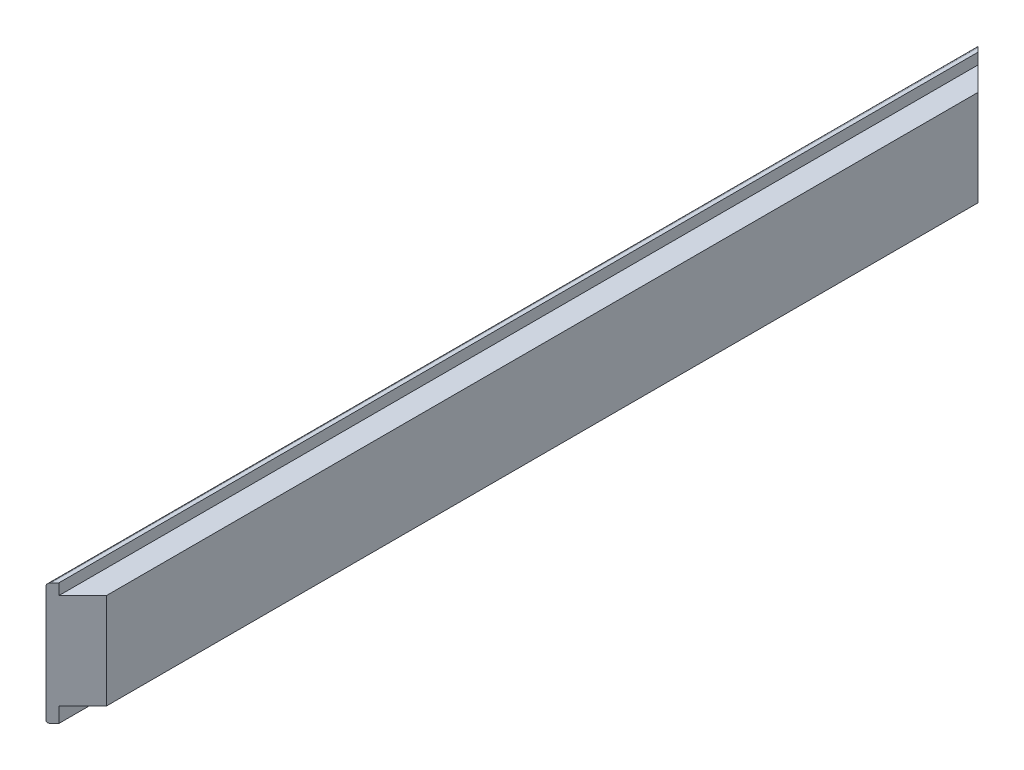
ISO-10303-21;
HEADER;
FILE_DESCRIPTION(('STEP AP214'),'2;1');
FILE_NAME('part.step','',(''),(''),'','','');
FILE_SCHEMA(('AUTOMOTIVE_DESIGN { 1 0 10303 214 1 1 1 1 }'));
ENDSEC;
DATA;
#1=APPLICATION_CONTEXT('core data for automotive mechanical design processes');
#2=APPLICATION_PROTOCOL_DEFINITION('international standard','automotive_design',2000,#1);
#3=PRODUCT_CONTEXT('',#1,'mechanical');
#4=PRODUCT('Part','Part','',(#3));
#5=PRODUCT_RELATED_PRODUCT_CATEGORY('part','',(#4));
#6=PRODUCT_DEFINITION_FORMATION('','',#4);
#7=PRODUCT_DEFINITION_CONTEXT('part definition',#1,'design');
#8=PRODUCT_DEFINITION('design','',#6,#7);
#9=PRODUCT_DEFINITION_SHAPE('','',#8);
#10=(LENGTH_UNIT() NAMED_UNIT(*) SI_UNIT(.MILLI.,.METRE.));
#11=(NAMED_UNIT(*) PLANE_ANGLE_UNIT() SI_UNIT($,.RADIAN.));
#12=(NAMED_UNIT(*) SI_UNIT($,.STERADIAN.) SOLID_ANGLE_UNIT());
#13=UNCERTAINTY_MEASURE_WITH_UNIT(LENGTH_MEASURE(1.E-05),#10,'distance_accuracy_value','');
#14=(GEOMETRIC_REPRESENTATION_CONTEXT(3) GLOBAL_UNCERTAINTY_ASSIGNED_CONTEXT((#13)) GLOBAL_UNIT_ASSIGNED_CONTEXT((#10,
#11,#12)) REPRESENTATION_CONTEXT('',''));
#15=CARTESIAN_POINT('',(0.,0.,0.));
#16=DIRECTION('',(0.,0.,1.));
#17=DIRECTION('',(1.,0.,0.));
#18=AXIS2_PLACEMENT_3D('',#15,#16,#17);
#19=CARTESIAN_POINT('',(0.,0.,294.550000053));
#20=DIRECTION('',(0.,1.,0.));
#21=DIRECTION('',(-1.,0.,0.));
#22=AXIS2_PLACEMENT_3D('',#19,#20,#21);
#23=PLANE('',#22);
#24=DIRECTION('',(0.707106781186547,0.,-0.707106781186548));
#25=VECTOR('',#24,1.);
#26=CARTESIAN_POINT('',(147.2750000265,0.,147.2750000265));
#27=LINE('',#26,#25);
#28=CARTESIAN_POINT('',(1.5875,0.,292.962500053));
#29=VERTEX_POINT('',#28);
#30=CARTESIAN_POINT('',(4.05000002800002,0.,290.500000025));
#31=VERTEX_POINT('',#30);
#32=EDGE_CURVE('E145',#29,#31,#27,.T.);
#33=ORIENTED_EDGE('',*,*,#32,.F.);
#34=DIRECTION('',(0.,0.,-1.));
#35=VECTOR('',#34,1.);
#36=CARTESIAN_POINT('',(1.5875,0.,-294.550000053));
#37=LINE('',#36,#35);
#38=CARTESIAN_POINT('',(1.5875,0.,-292.962500053));
#39=VERTEX_POINT('',#38);
#40=EDGE_CURVE('E204',#29,#39,#37,.T.);
#41=ORIENTED_EDGE('',*,*,#40,.T.);
#42=DIRECTION('',(0.707106781186547,0.,0.707106781186548));
#43=VECTOR('',#42,1.);
#44=CARTESIAN_POINT('',(147.2750000265,0.,-147.2750000265));
#45=LINE('',#44,#43);
#46=CARTESIAN_POINT('',(4.05000002800002,0.,-290.500000025));
#47=VERTEX_POINT('',#46);
#48=EDGE_CURVE('E144',#39,#47,#45,.T.);
#49=ORIENTED_EDGE('',*,*,#48,.T.);
#50=DIRECTION('',(0.,0.,-1.));
#51=VECTOR('',#50,1.);
#52=CARTESIAN_POINT('',(4.050000028,0.,294.550000053));
#53=LINE('',#52,#51);
#54=EDGE_CURVE('E201',#31,#47,#53,.T.);
#55=ORIENTED_EDGE('',*,*,#54,.F.);
#56=EDGE_LOOP('',(#33,#41,#49,#55));
#57=FACE_BOUND('',#56,.T.);
#58=ADVANCED_FACE('F43',(#57),#23,.F.);
#59=CARTESIAN_POINT('',(4.050000028,0.,294.550000053));
#60=DIRECTION('',(-1.,0.,0.));
#61=DIRECTION('',(0.,0.,1.));
#62=AXIS2_PLACEMENT_3D('',#59,#60,#61);
#63=PLANE('',#62);
#64=DIRECTION('',(0.,1.,0.));
#65=VECTOR('',#64,1.);
#66=CARTESIAN_POINT('',(4.050000028,0.,290.500000025));
#67=LINE('',#66,#65);
#68=CARTESIAN_POINT('',(4.050000028,9.525,290.500000025));
#69=VERTEX_POINT('',#68);
#70=EDGE_CURVE('E180',#31,#69,#67,.T.);
#71=ORIENTED_EDGE('',*,*,#70,.F.);
#72=ORIENTED_EDGE('',*,*,#54,.T.);
#73=DIRECTION('',(0.,1.,0.));
#74=VECTOR('',#73,1.);
#75=CARTESIAN_POINT('',(4.050000028,0.,-290.500000025));
#76=LINE('',#75,#74);
#77=CARTESIAN_POINT('',(4.05000002800004,9.525,-290.500000025));
#78=VERTEX_POINT('',#77);
#79=EDGE_CURVE('E165',#47,#78,#76,.T.);
#80=ORIENTED_EDGE('',*,*,#79,.T.);
#81=DIRECTION('',(0.,0.,-1.));
#82=VECTOR('',#81,1.);
#83=CARTESIAN_POINT('',(4.050000028,9.525,294.550000053));
#84=LINE('',#83,#82);
#85=EDGE_CURVE('E198',#69,#78,#84,.T.);
#86=ORIENTED_EDGE('',*,*,#85,.F.);
#87=EDGE_LOOP('',(#71,#72,#80,#86));
#88=FACE_BOUND('',#87,.T.);
#89=ADVANCED_FACE('F237',(#88),#63,.F.);
#90=CARTESIAN_POINT('',(0.,9.525,294.550000053));
#91=DIRECTION('',(0.,-1.,0.));
#92=DIRECTION('',(1.,0.,0.));
#93=AXIS2_PLACEMENT_3D('',#90,#91,#92);
#94=PLANE('',#93);
#95=CARTESIAN_POINT('',(11.550000014,9.525,104.550000053));
#96=DIRECTION('',(0.,-1.,0.));
#97=DIRECTION('',(0.,0.,-1.));
#98=AXIS2_PLACEMENT_3D('',#95,#96,#97);
#99=CIRCLE('',#98,3.95);
#100=CARTESIAN_POINT('',(11.550000014,9.525,100.600000053));
#101=VERTEX_POINT('',#100);
#102=EDGE_CURVE('E134',#101,#101,#99,.T.);
#103=ORIENTED_EDGE('',*,*,#102,.F.);
#104=EDGE_LOOP('',(#103));
#105=FACE_BOUND('',#104,.T.);
#106=CARTESIAN_POINT('',(11.550000014,9.525,-104.550000053));
#107=DIRECTION('',(0.,-1.,0.));
#108=DIRECTION('',(0.,0.,-1.));
#109=AXIS2_PLACEMENT_3D('',#106,#107,#108);
#110=CIRCLE('',#109,3.95);
#111=CARTESIAN_POINT('',(11.550000014,9.525,-108.500000053));
#112=VERTEX_POINT('',#111);
#113=EDGE_CURVE('E133',#112,#112,#110,.T.);
#114=ORIENTED_EDGE('',*,*,#113,.F.);
#115=EDGE_LOOP('',(#114));
#116=FACE_BOUND('',#115,.T.);
#117=DIRECTION('',(0.,0.,-1.));
#118=VECTOR('',#117,1.);
#119=CARTESIAN_POINT('',(19.05,9.525,294.550000053));
#120=LINE('',#119,#118);
#121=CARTESIAN_POINT('',(19.05,9.525,275.500000053));
#122=VERTEX_POINT('',#121);
#123=CARTESIAN_POINT('',(19.05,9.525,-275.500000053));
#124=VERTEX_POINT('',#123);
#125=EDGE_CURVE('E195',#122,#124,#120,.T.);
#126=ORIENTED_EDGE('',*,*,#125,.F.);
#127=DIRECTION('',(-0.707106781186547,0.,0.707106781186548));
#128=VECTOR('',#127,1.);
#129=CARTESIAN_POINT('',(0.,9.525,294.550000053));
#130=LINE('',#129,#128);
#131=EDGE_CURVE('E177',#122,#69,#130,.T.);
#132=ORIENTED_EDGE('',*,*,#131,.T.);
#133=ORIENTED_EDGE('',*,*,#85,.T.);
#134=DIRECTION('',(-0.707106781186547,0.,-0.707106781186548));
#135=VECTOR('',#134,1.);
#136=CARTESIAN_POINT('',(294.550000053,9.52500000000007,1.11022302462516E-13));
#137=LINE('',#136,#135);
#138=EDGE_CURVE('E163',#124,#78,#137,.T.);
#139=ORIENTED_EDGE('',*,*,#138,.F.);
#140=EDGE_LOOP('',(#126,#132,#133,#139));
#141=FACE_BOUND('',#140,.T.);
#142=ADVANCED_FACE('F242',(#105,#116,#141),#94,.T.);
#143=CARTESIAN_POINT('',(19.05,0.,294.550000053));
#144=DIRECTION('',(-1.,0.,0.));
#145=DIRECTION('',(0.,0.,1.));
#146=AXIS2_PLACEMENT_3D('',#143,#144,#145);
#147=PLANE('',#146);
#148=DIRECTION('',(0.,1.,0.));
#149=VECTOR('',#148,1.);
#150=CARTESIAN_POINT('',(19.05,0.,275.500000053));
#151=LINE('',#150,#149);
#152=CARTESIAN_POINT('',(19.05,70.000000208,275.500000053));
#153=VERTEX_POINT('',#152);
#154=EDGE_CURVE('E147',#122,#153,#151,.T.);
#155=ORIENTED_EDGE('',*,*,#154,.F.);
#156=ORIENTED_EDGE('',*,*,#125,.T.);
#157=DIRECTION('',(0.,1.,0.));
#158=VECTOR('',#157,1.);
#159=CARTESIAN_POINT('',(19.05,0.,-275.500000053));
#160=LINE('',#159,#158);
#161=CARTESIAN_POINT('',(19.05,70.000000208,-275.500000053));
#162=VERTEX_POINT('',#161);
#163=EDGE_CURVE('E148',#124,#162,#160,.T.);
#164=ORIENTED_EDGE('',*,*,#163,.T.);
#165=DIRECTION('',(0.,0.,-1.));
#166=VECTOR('',#165,1.);
#167=CARTESIAN_POINT('',(19.05,70.000000208,294.550000053));
#168=LINE('',#167,#166);
#169=EDGE_CURVE('E192',#153,#162,#168,.T.);
#170=ORIENTED_EDGE('',*,*,#169,.F.);
#171=EDGE_LOOP('',(#155,#156,#164,#170));
#172=FACE_BOUND('',#171,.T.);
#173=ADVANCED_FACE('F245',(#172),#147,.F.);
#174=CARTESIAN_POINT('',(0.,70.000000208,294.550000053));
#175=DIRECTION('',(0.,-1.,0.));
#176=DIRECTION('',(0.,0.,-1.));
#177=AXIS2_PLACEMENT_3D('',#174,#175,#176);
#178=PLANE('',#177);
#179=DIRECTION('',(-0.707106781186547,0.,0.707106781186548));
#180=VECTOR('',#179,1.);
#181=CARTESIAN_POINT('',(0.,70.000000208,294.550000053));
#182=LINE('',#181,#180);
#183=CARTESIAN_POINT('',(4.050000028,70.000000208,290.500000025));
#184=VERTEX_POINT('',#183);
#185=EDGE_CURVE('E172',#153,#184,#182,.T.);
#186=ORIENTED_EDGE('',*,*,#185,.F.);
#187=ORIENTED_EDGE('',*,*,#169,.T.);
#188=DIRECTION('',(-0.707106781186547,0.,-0.707106781186548));
#189=VECTOR('',#188,1.);
#190=CARTESIAN_POINT('',(294.550000053,70.000000208,1.11022302462516E-13));
#191=LINE('',#190,#189);
#192=CARTESIAN_POINT('',(4.050000028,70.000000208,-290.500000025));
#193=VERTEX_POINT('',#192);
#194=EDGE_CURVE('E158',#162,#193,#191,.T.);
#195=ORIENTED_EDGE('',*,*,#194,.T.);
#196=DIRECTION('',(0.,0.,-1.));
#197=VECTOR('',#196,1.);
#198=CARTESIAN_POINT('',(4.050000028,70.000000208,294.550000053));
#199=LINE('',#198,#197);
#200=EDGE_CURVE('E189',#184,#193,#199,.T.);
#201=ORIENTED_EDGE('',*,*,#200,.F.);
#202=EDGE_LOOP('',(#186,#187,#195,#201));
#203=FACE_BOUND('',#202,.T.);
#204=ADVANCED_FACE('F250',(#203),#178,.F.);
#205=CARTESIAN_POINT('',(4.05000002799997,0.,294.550000053));
#206=DIRECTION('',(1.,0.,0.));
#207=DIRECTION('',(0.,1.,0.));
#208=AXIS2_PLACEMENT_3D('',#205,#206,#207);
#209=PLANE('',#208);
#210=DIRECTION('',(0.,0.,-1.));
#211=VECTOR('',#210,1.);
#212=CARTESIAN_POINT('',(4.05000002800001,77.000000178,294.550000053));
#213=LINE('',#212,#211);
#214=CARTESIAN_POINT('',(4.05000002800001,77.000000178,290.500000025));
#215=VERTEX_POINT('',#214);
#216=CARTESIAN_POINT('',(4.05000002799999,77.000000178,-290.500000025));
#217=VERTEX_POINT('',#216);
#218=EDGE_CURVE('E185',#215,#217,#213,.T.);
#219=ORIENTED_EDGE('',*,*,#218,.F.);
#220=DIRECTION('',(0.,-1.,0.));
#221=VECTOR('',#220,1.);
#222=CARTESIAN_POINT('',(4.05000002799997,0.,290.500000025));
#223=LINE('',#222,#221);
#224=EDGE_CURVE('E169',#215,#184,#223,.T.);
#225=ORIENTED_EDGE('',*,*,#224,.T.);
#226=ORIENTED_EDGE('',*,*,#200,.T.);
#227=DIRECTION('',(0.,-1.,0.));
#228=VECTOR('',#227,1.);
#229=CARTESIAN_POINT('',(4.05000002799997,2.87964098271064E-13,-290.500000025));
#230=LINE('',#229,#228);
#231=EDGE_CURVE('E156',#217,#193,#230,.T.);
#232=ORIENTED_EDGE('',*,*,#231,.F.);
#233=EDGE_LOOP('',(#219,#225,#226,#232));
#234=FACE_BOUND('',#233,.T.);
#235=ADVANCED_FACE('F252',(#234),#209,.T.);
#236=CARTESIAN_POINT('',(0.,77.000000178,294.550000053));
#237=DIRECTION('',(0.,1.,0.));
#238=DIRECTION('',(0.,0.,1.));
#239=AXIS2_PLACEMENT_3D('',#236,#237,#238);
#240=PLANE('',#239);
#241=DIRECTION('',(0.,0.,-1.));
#242=VECTOR('',#241,1.);
#243=CARTESIAN_POINT('',(1.5875,77.000000178,294.550000053));
#244=LINE('',#243,#242);
#245=CARTESIAN_POINT('',(1.5875,77.000000178,-292.962500053));
#246=VERTEX_POINT('',#245);
#247=CARTESIAN_POINT('',(1.5875,77.000000178,292.962500053));
#248=VERTEX_POINT('',#247);
#249=EDGE_CURVE('E213',#246,#248,#244,.F.);
#250=ORIENTED_EDGE('',*,*,#249,.T.);
#251=DIRECTION('',(0.707106781186547,0.,-0.707106781186548));
#252=VECTOR('',#251,1.);
#253=CARTESIAN_POINT('',(0.,77.000000178,294.550000053));
#254=LINE('',#253,#252);
#255=EDGE_CURVE('E58',#248,#215,#254,.T.);
#256=ORIENTED_EDGE('',*,*,#255,.T.);
#257=ORIENTED_EDGE('',*,*,#218,.T.);
#258=DIRECTION('',(0.707106781186547,0.,0.707106781186548));
#259=VECTOR('',#258,1.);
#260=CARTESIAN_POINT('',(294.550000053,77.000000178,1.11022302462516E-13));
#261=LINE('',#260,#259);
#262=EDGE_CURVE('E150',#246,#217,#261,.T.);
#263=ORIENTED_EDGE('',*,*,#262,.F.);
#264=EDGE_LOOP('',(#250,#256,#257,#263));
#265=FACE_BOUND('',#264,.T.);
#266=ADVANCED_FACE('F222',(#265),#240,.T.);
#267=CARTESIAN_POINT('',(1.5875,1.5875,294.550000053));
#268=DIRECTION('',(0.,0.,1.));
#269=DIRECTION('',(1.,0.,0.));
#270=AXIS2_PLACEMENT_3D('',#267,#268,#269);
#271=CYLINDRICAL_SURFACE('',#270,1.5875);
#272=ORIENTED_EDGE('',*,*,#40,.F.);
#273=CARTESIAN_POINT('',(1.5875,1.5875,292.962500053));
#274=DIRECTION('',(0.707106781186548,0.,0.707106781186547));
#275=DIRECTION('',(-0.707106781186547,0.,0.707106781186548));
#276=AXIS2_PLACEMENT_3D('',#273,#274,#275);
#277=ELLIPSE('',#276,2.24506403026729,1.5875);
#278=CARTESIAN_POINT('',(0.,1.5875,294.550000053));
#279=VERTEX_POINT('',#278);
#280=EDGE_CURVE('E174',#29,#279,#277,.F.);
#281=ORIENTED_EDGE('',*,*,#280,.T.);
#282=DIRECTION('',(0.,0.,-1.));
#283=VECTOR('',#282,1.);
#284=CARTESIAN_POINT('',(0.,1.5875,294.550000053));
#285=LINE('',#284,#283);
#286=CARTESIAN_POINT('',(0.,1.5875,-294.550000053));
#287=VERTEX_POINT('',#286);
#288=EDGE_CURVE('E210',#287,#279,#285,.F.);
#289=ORIENTED_EDGE('',*,*,#288,.F.);
#290=CARTESIAN_POINT('',(1.5875,1.5875,-292.962500053));
#291=DIRECTION('',(-0.707106781186548,0.,0.707106781186547));
#292=DIRECTION('',(0.707106781186547,0.,0.707106781186548));
#293=AXIS2_PLACEMENT_3D('',#290,#291,#292);
#294=ELLIPSE('',#293,2.24506403026729,1.5875);
#295=EDGE_CURVE('E161',#39,#287,#294,.F.);
#296=ORIENTED_EDGE('',*,*,#295,.F.);
#297=EDGE_LOOP('',(#272,#281,#289,#296));
#298=FACE_BOUND('',#297,.T.);
#299=ADVANCED_FACE('F231',(#298),#271,.T.);
#300=CARTESIAN_POINT('',(1.5875,75.412500178,294.550000053));
#301=DIRECTION('',(0.,0.,-1.));
#302=DIRECTION('',(-1.,0.,0.));
#303=AXIS2_PLACEMENT_3D('',#300,#301,#302);
#304=CYLINDRICAL_SURFACE('',#303,1.5875);
#305=DIRECTION('',(0.,0.,-1.));
#306=VECTOR('',#305,1.);
#307=CARTESIAN_POINT('',(0.,75.412500178,294.550000053));
#308=LINE('',#307,#306);
#309=CARTESIAN_POINT('',(0.,75.412500178,294.550000053));
#310=VERTEX_POINT('',#309);
#311=CARTESIAN_POINT('',(0.,75.412500178,-294.550000053));
#312=VERTEX_POINT('',#311);
#313=EDGE_CURVE('E207',#310,#312,#308,.T.);
#314=ORIENTED_EDGE('',*,*,#313,.F.);
#315=CARTESIAN_POINT('',(1.5875,75.412500178,292.962500053));
#316=DIRECTION('',(0.707106781186548,0.,0.707106781186547));
#317=DIRECTION('',(0.707106781186547,0.,-0.707106781186548));
#318=AXIS2_PLACEMENT_3D('',#315,#316,#317);
#319=ELLIPSE('',#318,2.24506403026729,1.5875);
#320=EDGE_CURVE('E11',#310,#248,#319,.F.);
#321=ORIENTED_EDGE('',*,*,#320,.T.);
#322=ORIENTED_EDGE('',*,*,#249,.F.);
#323=CARTESIAN_POINT('',(1.5875,75.412500178,-292.962500053));
#324=DIRECTION('',(-0.707106781186548,0.,0.707106781186547));
#325=DIRECTION('',(-0.707106781186547,0.,-0.707106781186548));
#326=AXIS2_PLACEMENT_3D('',#323,#324,#325);
#327=ELLIPSE('',#326,2.24506403026729,1.5875);
#328=EDGE_CURVE('E51',#312,#246,#327,.F.);
#329=ORIENTED_EDGE('',*,*,#328,.F.);
#330=EDGE_LOOP('',(#314,#321,#322,#329));
#331=FACE_BOUND('',#330,.T.);
#332=ADVANCED_FACE('F45',(#331),#304,.T.);
#333=CARTESIAN_POINT('',(0.,0.,294.550000053));
#334=DIRECTION('',(-1.,0.,0.));
#335=DIRECTION('',(0.,0.,1.));
#336=AXIS2_PLACEMENT_3D('',#333,#334,#335);
#337=PLANE('',#336);
#338=DIRECTION('',(0.,1.,0.));
#339=VECTOR('',#338,1.);
#340=CARTESIAN_POINT('',(0.,0.,-294.550000053));
#341=LINE('',#340,#339);
#342=EDGE_CURVE('E65',#287,#312,#341,.T.);
#343=ORIENTED_EDGE('',*,*,#342,.F.);
#344=ORIENTED_EDGE('',*,*,#288,.T.);
#345=DIRECTION('',(0.,1.,0.));
#346=VECTOR('',#345,1.);
#347=CARTESIAN_POINT('',(0.,0.,294.550000053));
#348=LINE('',#347,#346);
#349=EDGE_CURVE('E182',#279,#310,#348,.T.);
#350=ORIENTED_EDGE('',*,*,#349,.T.);
#351=ORIENTED_EDGE('',*,*,#313,.T.);
#352=EDGE_LOOP('',(#343,#344,#350,#351));
#353=FACE_BOUND('',#352,.T.);
#354=ADVANCED_FACE('F226',(#353),#337,.T.);
#355=CARTESIAN_POINT('',(147.2750000265,0.,-147.2750000265));
#356=DIRECTION('',(-0.707106781186548,0.,0.707106781186547));
#357=DIRECTION('',(0.707106781186547,0.,0.707106781186548));
#358=AXIS2_PLACEMENT_3D('',#355,#356,#357);
#359=PLANE('',#358);
#360=ORIENTED_EDGE('',*,*,#48,.F.);
#361=ORIENTED_EDGE('',*,*,#295,.T.);
#362=ORIENTED_EDGE('',*,*,#342,.T.);
#363=ORIENTED_EDGE('',*,*,#328,.T.);
#364=ORIENTED_EDGE('',*,*,#262,.T.);
#365=ORIENTED_EDGE('',*,*,#231,.T.);
#366=ORIENTED_EDGE('',*,*,#194,.F.);
#367=ORIENTED_EDGE('',*,*,#163,.F.);
#368=ORIENTED_EDGE('',*,*,#138,.T.);
#369=ORIENTED_EDGE('',*,*,#79,.F.);
#370=EDGE_LOOP('',(#360,#361,#362,#363,#364,#365,#366,#367,#368,#369));
#371=FACE_BOUND('',#370,.T.);
#372=ADVANCED_FACE('F216',(#371),#359,.F.);
#373=CARTESIAN_POINT('',(147.2750000265,0.,147.2750000265));
#374=DIRECTION('',(0.707106781186548,0.,0.707106781186547));
#375=DIRECTION('',(0.707106781186547,0.,-0.707106781186548));
#376=AXIS2_PLACEMENT_3D('',#373,#374,#375);
#377=PLANE('',#376);
#378=ORIENTED_EDGE('',*,*,#70,.T.);
#379=ORIENTED_EDGE('',*,*,#131,.F.);
#380=ORIENTED_EDGE('',*,*,#154,.T.);
#381=ORIENTED_EDGE('',*,*,#185,.T.);
#382=ORIENTED_EDGE('',*,*,#224,.F.);
#383=ORIENTED_EDGE('',*,*,#255,.F.);
#384=ORIENTED_EDGE('',*,*,#320,.F.);
#385=ORIENTED_EDGE('',*,*,#349,.F.);
#386=ORIENTED_EDGE('',*,*,#280,.F.);
#387=ORIENTED_EDGE('',*,*,#32,.T.);
#388=EDGE_LOOP('',(#378,#379,#380,#381,#382,#383,#384,#385,#386,#387));
#389=FACE_BOUND('',#388,.T.);
#390=ADVANCED_FACE('F224',(#389),#377,.T.);
#391=CARTESIAN_POINT('',(11.550000014,24.525,-104.550000053));
#392=DIRECTION('',(0.,-1.,0.));
#393=DIRECTION('',(0.,0.,-1.));
#394=AXIS2_PLACEMENT_3D('',#391,#392,#393);
#395=CONICAL_SURFACE('',#394,3.95,1.02974425867665);
#396=CARTESIAN_POINT('',(11.550000014,26.8983994451589,-104.550000053));
#397=VERTEX_POINT('',#396);
#398=VERTEX_LOOP('',#397);
#399=FACE_BOUND('',#398,.T.);
#400=CARTESIAN_POINT('',(11.550000014,24.525,-104.550000053));
#401=DIRECTION('',(0.,-1.,0.));
#402=DIRECTION('',(0.,0.,-1.));
#403=AXIS2_PLACEMENT_3D('',#400,#401,#402);
#404=CIRCLE('',#403,3.95);
#405=CARTESIAN_POINT('',(11.550000014,24.525,-108.500000053));
#406=VERTEX_POINT('',#405);
#407=EDGE_CURVE('E137',#406,#406,#404,.T.);
#408=ORIENTED_EDGE('',*,*,#407,.T.);
#409=EDGE_LOOP('',(#408));
#410=FACE_BOUND('',#409,.T.);
#411=ADVANCED_FACE('F283',(#399,#410),#395,.F.);
#412=CARTESIAN_POINT('',(11.550000014,9.525,-104.550000053));
#413=DIRECTION('',(0.,-1.,0.));
#414=DIRECTION('',(0.,0.,-1.));
#415=AXIS2_PLACEMENT_3D('',#412,#413,#414);
#416=CYLINDRICAL_SURFACE('',#415,3.95);
#417=ORIENTED_EDGE('',*,*,#407,.F.);
#418=EDGE_LOOP('',(#417));
#419=FACE_BOUND('',#418,.T.);
#420=ORIENTED_EDGE('',*,*,#113,.T.);
#421=EDGE_LOOP('',(#420));
#422=FACE_BOUND('',#421,.T.);
#423=ADVANCED_FACE('F127',(#419,#422),#416,.F.);
#424=CARTESIAN_POINT('',(11.550000014,24.525,104.550000053));
#425=DIRECTION('',(0.,-1.,0.));
#426=DIRECTION('',(0.,0.,-1.));
#427=AXIS2_PLACEMENT_3D('',#424,#425,#426);
#428=CONICAL_SURFACE('',#427,3.95,1.02974425867665);
#429=CARTESIAN_POINT('',(11.550000014,26.8983994451589,104.550000053));
#430=VERTEX_POINT('',#429);
#431=VERTEX_LOOP('',#430);
#432=FACE_BOUND('',#431,.T.);
#433=CARTESIAN_POINT('',(11.550000014,24.525,104.550000053));
#434=DIRECTION('',(0.,-1.,0.));
#435=DIRECTION('',(0.,0.,-1.));
#436=AXIS2_PLACEMENT_3D('',#433,#434,#435);
#437=CIRCLE('',#436,3.95);
#438=CARTESIAN_POINT('',(11.550000014,24.525,100.600000053));
#439=VERTEX_POINT('',#438);
#440=EDGE_CURVE('E131',#439,#439,#437,.T.);
#441=ORIENTED_EDGE('',*,*,#440,.T.);
#442=EDGE_LOOP('',(#441));
#443=FACE_BOUND('',#442,.T.);
#444=ADVANCED_FACE('F123',(#432,#443),#428,.F.);
#445=CARTESIAN_POINT('',(11.550000014,9.525,104.550000053));
#446=DIRECTION('',(0.,-1.,0.));
#447=DIRECTION('',(0.,0.,-1.));
#448=AXIS2_PLACEMENT_3D('',#445,#446,#447);
#449=CYLINDRICAL_SURFACE('',#448,3.95);
#450=ORIENTED_EDGE('',*,*,#440,.F.);
#451=EDGE_LOOP('',(#450));
#452=FACE_BOUND('',#451,.T.);
#453=ORIENTED_EDGE('',*,*,#102,.T.);
#454=EDGE_LOOP('',(#453));
#455=FACE_BOUND('',#454,.T.);
#456=ADVANCED_FACE('F126',(#452,#455),#449,.F.);
#457=CLOSED_SHELL('',(#58,#89,#142,#173,#204,#235,#266,#299,#332,#354,#372,#390,#411,#423,#444,#456));
#458=MANIFOLD_SOLID_BREP('B2',#457);
#459=ADVANCED_BREP_SHAPE_REPRESENTATION('',(#18,#458),#14);
#460=SHAPE_DEFINITION_REPRESENTATION(#9,#459);
ENDSEC;
END-ISO-10303-21;
